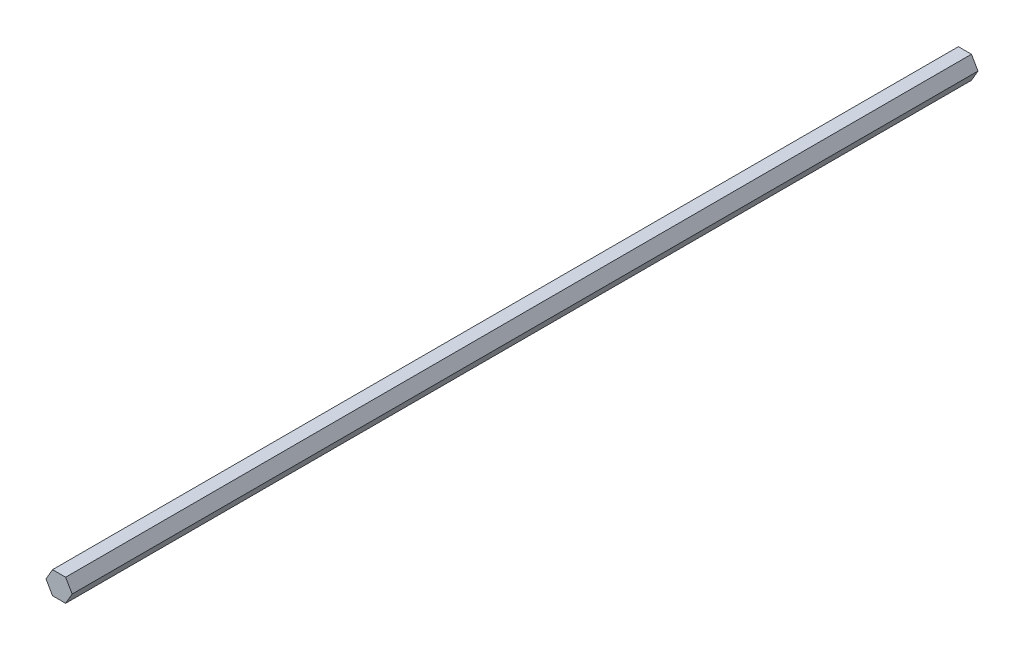
ISO-10303-21;
HEADER;
FILE_DESCRIPTION(('STEP AP214'),'2;1');
FILE_NAME('part.step','',(''),(''),'','','');
FILE_SCHEMA(('AUTOMOTIVE_DESIGN { 1 0 10303 214 1 1 1 1 }'));
ENDSEC;
DATA;
#1=APPLICATION_CONTEXT('core data for automotive mechanical design processes');
#2=APPLICATION_PROTOCOL_DEFINITION('international standard','automotive_design',2000,#1);
#3=PRODUCT_CONTEXT('',#1,'mechanical');
#4=PRODUCT('Part','Part','',(#3));
#5=PRODUCT_RELATED_PRODUCT_CATEGORY('part','',(#4));
#6=PRODUCT_DEFINITION_FORMATION('','',#4);
#7=PRODUCT_DEFINITION_CONTEXT('part definition',#1,'design');
#8=PRODUCT_DEFINITION('design','',#6,#7);
#9=PRODUCT_DEFINITION_SHAPE('','',#8);
#10=(LENGTH_UNIT() NAMED_UNIT(*) SI_UNIT(.MILLI.,.METRE.));
#11=(NAMED_UNIT(*) PLANE_ANGLE_UNIT() SI_UNIT($,.RADIAN.));
#12=(NAMED_UNIT(*) SI_UNIT($,.STERADIAN.) SOLID_ANGLE_UNIT());
#13=UNCERTAINTY_MEASURE_WITH_UNIT(LENGTH_MEASURE(1.E-05),#10,'distance_accuracy_value','');
#14=(GEOMETRIC_REPRESENTATION_CONTEXT(3) GLOBAL_UNCERTAINTY_ASSIGNED_CONTEXT((#13)) GLOBAL_UNIT_ASSIGNED_CONTEXT((#10,
#11,#12)) REPRESENTATION_CONTEXT('',''));
#15=CARTESIAN_POINT('',(0.,0.,0.));
#16=DIRECTION('',(0.,0.,1.));
#17=DIRECTION('',(1.,0.,0.));
#18=AXIS2_PLACEMENT_3D('',#15,#16,#17);
#19=CARTESIAN_POINT('',(1.44337567297407,-2.5,200.));
#20=DIRECTION('',(-0.866025403784439,0.5,0.));
#21=DIRECTION('',(-0.5,-0.866025403784439,0.));
#22=AXIS2_PLACEMENT_3D('',#19,#20,#21);
#23=PLANE('',#22);
#24=DIRECTION('',(0.5,0.866025403784439,0.));
#25=VECTOR('',#24,1.);
#26=CARTESIAN_POINT('',(1.44337567297407,-2.5,0.));
#27=LINE('',#26,#25);
#28=CARTESIAN_POINT('',(1.44337567297407,-2.5,0.));
#29=VERTEX_POINT('',#28);
#30=CARTESIAN_POINT('',(2.88675134594813,0.,0.));
#31=VERTEX_POINT('',#30);
#32=EDGE_CURVE('E117',#29,#31,#27,.T.);
#33=ORIENTED_EDGE('',*,*,#32,.T.);
#34=DIRECTION('',(0.,0.,-1.));
#35=VECTOR('',#34,1.);
#36=CARTESIAN_POINT('',(2.88675134594813,0.,200.));
#37=LINE('',#36,#35);
#38=CARTESIAN_POINT('',(2.88675134594813,0.,200.));
#39=VERTEX_POINT('',#38);
#40=EDGE_CURVE('E11',#39,#31,#37,.T.);
#41=ORIENTED_EDGE('',*,*,#40,.F.);
#42=DIRECTION('',(0.5,0.866025403784439,0.));
#43=VECTOR('',#42,1.);
#44=CARTESIAN_POINT('',(1.44337567297407,-2.5,200.));
#45=LINE('',#44,#43);
#46=CARTESIAN_POINT('',(1.44337567297407,-2.5,200.));
#47=VERTEX_POINT('',#46);
#48=EDGE_CURVE('E127',#47,#39,#45,.T.);
#49=ORIENTED_EDGE('',*,*,#48,.F.);
#50=DIRECTION('',(0.,0.,-1.));
#51=VECTOR('',#50,1.);
#52=CARTESIAN_POINT('',(1.44337567297407,-2.5,200.));
#53=LINE('',#52,#51);
#54=EDGE_CURVE('E113',#47,#29,#53,.T.);
#55=ORIENTED_EDGE('',*,*,#54,.T.);
#56=EDGE_LOOP('',(#33,#41,#49,#55));
#57=FACE_BOUND('',#56,.T.);
#58=ADVANCED_FACE('F33',(#57),#23,.F.);
#59=CARTESIAN_POINT('',(2.88675134594813,0.,200.));
#60=DIRECTION('',(-0.866025403784439,-0.5,0.));
#61=DIRECTION('',(0.5,-0.866025403784439,0.));
#62=AXIS2_PLACEMENT_3D('',#59,#60,#61);
#63=PLANE('',#62);
#64=DIRECTION('',(-0.5,0.866025403784439,0.));
#65=VECTOR('',#64,1.);
#66=CARTESIAN_POINT('',(2.88675134594813,0.,0.));
#67=LINE('',#66,#65);
#68=CARTESIAN_POINT('',(1.44337567297406,2.5,0.));
#69=VERTEX_POINT('',#68);
#70=EDGE_CURVE('E120',#31,#69,#67,.T.);
#71=ORIENTED_EDGE('',*,*,#70,.T.);
#72=DIRECTION('',(0.,0.,-1.));
#73=VECTOR('',#72,1.);
#74=CARTESIAN_POINT('',(1.44337567297406,2.5,200.));
#75=LINE('',#74,#73);
#76=CARTESIAN_POINT('',(1.44337567297406,2.5,200.));
#77=VERTEX_POINT('',#76);
#78=EDGE_CURVE('E41',#77,#69,#75,.T.);
#79=ORIENTED_EDGE('',*,*,#78,.F.);
#80=DIRECTION('',(-0.5,0.866025403784439,0.));
#81=VECTOR('',#80,1.);
#82=CARTESIAN_POINT('',(2.88675134594813,0.,200.));
#83=LINE('',#82,#81);
#84=EDGE_CURVE('E86',#39,#77,#83,.T.);
#85=ORIENTED_EDGE('',*,*,#84,.F.);
#86=ORIENTED_EDGE('',*,*,#40,.T.);
#87=EDGE_LOOP('',(#71,#79,#85,#86));
#88=FACE_BOUND('',#87,.T.);
#89=ADVANCED_FACE('F151',(#88),#63,.F.);
#90=CARTESIAN_POINT('',(1.44337567297406,2.5,200.));
#91=DIRECTION('',(0.,-1.,0.));
#92=DIRECTION('',(0.,0.,-1.));
#93=AXIS2_PLACEMENT_3D('',#90,#91,#92);
#94=PLANE('',#93);
#95=DIRECTION('',(-1.,0.,0.));
#96=VECTOR('',#95,1.);
#97=CARTESIAN_POINT('',(1.44337567297406,2.5,0.));
#98=LINE('',#97,#96);
#99=CARTESIAN_POINT('',(-1.44337567297406,2.5,0.));
#100=VERTEX_POINT('',#99);
#101=EDGE_CURVE('E122',#69,#100,#98,.T.);
#102=ORIENTED_EDGE('',*,*,#101,.T.);
#103=DIRECTION('',(0.,0.,-1.));
#104=VECTOR('',#103,1.);
#105=CARTESIAN_POINT('',(-1.44337567297406,2.5,200.));
#106=LINE('',#105,#104);
#107=CARTESIAN_POINT('',(-1.44337567297406,2.5,200.));
#108=VERTEX_POINT('',#107);
#109=EDGE_CURVE('E108',#108,#100,#106,.T.);
#110=ORIENTED_EDGE('',*,*,#109,.F.);
#111=DIRECTION('',(-1.,0.,0.));
#112=VECTOR('',#111,1.);
#113=CARTESIAN_POINT('',(1.44337567297406,2.5,200.));
#114=LINE('',#113,#112);
#115=EDGE_CURVE('E99',#77,#108,#114,.T.);
#116=ORIENTED_EDGE('',*,*,#115,.F.);
#117=ORIENTED_EDGE('',*,*,#78,.T.);
#118=EDGE_LOOP('',(#102,#110,#116,#117));
#119=FACE_BOUND('',#118,.T.);
#120=ADVANCED_FACE('F133',(#119),#94,.F.);
#121=CARTESIAN_POINT('',(-1.44337567297406,2.5,200.));
#122=DIRECTION('',(0.866025403784439,-0.5,0.));
#123=DIRECTION('',(0.5,0.866025403784439,0.));
#124=AXIS2_PLACEMENT_3D('',#121,#122,#123);
#125=PLANE('',#124);
#126=DIRECTION('',(-0.5,-0.866025403784439,0.));
#127=VECTOR('',#126,1.);
#128=CARTESIAN_POINT('',(-1.44337567297406,2.5,0.));
#129=LINE('',#128,#127);
#130=CARTESIAN_POINT('',(-2.88675134594813,0.,0.));
#131=VERTEX_POINT('',#130);
#132=EDGE_CURVE('E107',#100,#131,#129,.T.);
#133=ORIENTED_EDGE('',*,*,#132,.T.);
#134=DIRECTION('',(0.,0.,-1.));
#135=VECTOR('',#134,1.);
#136=CARTESIAN_POINT('',(-2.88675134594813,0.,200.));
#137=LINE('',#136,#135);
#138=CARTESIAN_POINT('',(-2.88675134594813,0.,200.));
#139=VERTEX_POINT('',#138);
#140=EDGE_CURVE('E104',#139,#131,#137,.T.);
#141=ORIENTED_EDGE('',*,*,#140,.F.);
#142=DIRECTION('',(-0.5,-0.866025403784439,0.));
#143=VECTOR('',#142,1.);
#144=CARTESIAN_POINT('',(-1.44337567297406,2.5,200.));
#145=LINE('',#144,#143);
#146=EDGE_CURVE('E93',#108,#139,#145,.T.);
#147=ORIENTED_EDGE('',*,*,#146,.F.);
#148=ORIENTED_EDGE('',*,*,#109,.T.);
#149=EDGE_LOOP('',(#133,#141,#147,#148));
#150=FACE_BOUND('',#149,.T.);
#151=ADVANCED_FACE('F105',(#150),#125,.F.);
#152=CARTESIAN_POINT('',(-2.88675134594813,0.,200.));
#153=DIRECTION('',(0.866025403784439,0.5,0.));
#154=DIRECTION('',(-0.5,0.866025403784439,0.));
#155=AXIS2_PLACEMENT_3D('',#152,#153,#154);
#156=PLANE('',#155);
#157=DIRECTION('',(0.5,-0.866025403784439,0.));
#158=VECTOR('',#157,1.);
#159=CARTESIAN_POINT('',(-2.88675134594813,0.,0.));
#160=LINE('',#159,#158);
#161=CARTESIAN_POINT('',(-1.44337567297406,-2.5,0.));
#162=VERTEX_POINT('',#161);
#163=EDGE_CURVE('E72',#131,#162,#160,.T.);
#164=ORIENTED_EDGE('',*,*,#163,.T.);
#165=DIRECTION('',(0.,0.,-1.));
#166=VECTOR('',#165,1.);
#167=CARTESIAN_POINT('',(-1.44337567297406,-2.5,200.));
#168=LINE('',#167,#166);
#169=CARTESIAN_POINT('',(-1.44337567297406,-2.5,200.));
#170=VERTEX_POINT('',#169);
#171=EDGE_CURVE('E109',#170,#162,#168,.T.);
#172=ORIENTED_EDGE('',*,*,#171,.F.);
#173=DIRECTION('',(0.5,-0.866025403784439,0.));
#174=VECTOR('',#173,1.);
#175=CARTESIAN_POINT('',(-2.88675134594813,0.,200.));
#176=LINE('',#175,#174);
#177=EDGE_CURVE('E97',#139,#170,#176,.T.);
#178=ORIENTED_EDGE('',*,*,#177,.F.);
#179=ORIENTED_EDGE('',*,*,#140,.T.);
#180=EDGE_LOOP('',(#164,#172,#178,#179));
#181=FACE_BOUND('',#180,.T.);
#182=ADVANCED_FACE('F111',(#181),#156,.F.);
#183=CARTESIAN_POINT('',(-1.44337567297406,-2.5,200.));
#184=DIRECTION('',(0.,1.,0.));
#185=DIRECTION('',(0.,0.,1.));
#186=AXIS2_PLACEMENT_3D('',#183,#184,#185);
#187=PLANE('',#186);
#188=DIRECTION('',(1.,0.,0.));
#189=VECTOR('',#188,1.);
#190=CARTESIAN_POINT('',(-1.44337567297406,-2.5,0.));
#191=LINE('',#190,#189);
#192=EDGE_CURVE('E78',#162,#29,#191,.T.);
#193=ORIENTED_EDGE('',*,*,#192,.T.);
#194=ORIENTED_EDGE('',*,*,#54,.F.);
#195=DIRECTION('',(1.,0.,0.));
#196=VECTOR('',#195,1.);
#197=CARTESIAN_POINT('',(-1.44337567297406,-2.5,200.));
#198=LINE('',#197,#196);
#199=EDGE_CURVE('E49',#170,#47,#198,.T.);
#200=ORIENTED_EDGE('',*,*,#199,.F.);
#201=ORIENTED_EDGE('',*,*,#171,.T.);
#202=EDGE_LOOP('',(#193,#194,#200,#201));
#203=FACE_BOUND('',#202,.T.);
#204=ADVANCED_FACE('F140',(#203),#187,.F.);
#205=CARTESIAN_POINT('',(0.,0.,200.));
#206=DIRECTION('',(0.,0.,1.));
#207=DIRECTION('',(1.,0.,0.));
#208=AXIS2_PLACEMENT_3D('',#205,#206,#207);
#209=PLANE('',#208);
#210=ORIENTED_EDGE('',*,*,#48,.T.);
#211=ORIENTED_EDGE('',*,*,#84,.T.);
#212=ORIENTED_EDGE('',*,*,#115,.T.);
#213=ORIENTED_EDGE('',*,*,#146,.T.);
#214=ORIENTED_EDGE('',*,*,#177,.T.);
#215=ORIENTED_EDGE('',*,*,#199,.T.);
#216=EDGE_LOOP('',(#210,#211,#212,#213,#214,#215));
#217=FACE_BOUND('',#216,.T.);
#218=ADVANCED_FACE('F95',(#217),#209,.T.);
#219=CARTESIAN_POINT('',(0.,0.,0.));
#220=DIRECTION('',(0.,0.,1.));
#221=DIRECTION('',(1.,0.,0.));
#222=AXIS2_PLACEMENT_3D('',#219,#220,#221);
#223=PLANE('',#222);
#224=ORIENTED_EDGE('',*,*,#32,.F.);
#225=ORIENTED_EDGE('',*,*,#192,.F.);
#226=ORIENTED_EDGE('',*,*,#163,.F.);
#227=ORIENTED_EDGE('',*,*,#132,.F.);
#228=ORIENTED_EDGE('',*,*,#101,.F.);
#229=ORIENTED_EDGE('',*,*,#70,.F.);
#230=EDGE_LOOP('',(#224,#225,#226,#227,#228,#229));
#231=FACE_BOUND('',#230,.T.);
#232=ADVANCED_FACE('F136',(#231),#223,.F.);
#233=CLOSED_SHELL('',(#58,#89,#120,#151,#182,#204,#218,#232));
#234=MANIFOLD_SOLID_BREP('B2',#233);
#235=ADVANCED_BREP_SHAPE_REPRESENTATION('',(#18,#234),#14);
#236=SHAPE_DEFINITION_REPRESENTATION(#9,#235);
ENDSEC;
END-ISO-10303-21;
